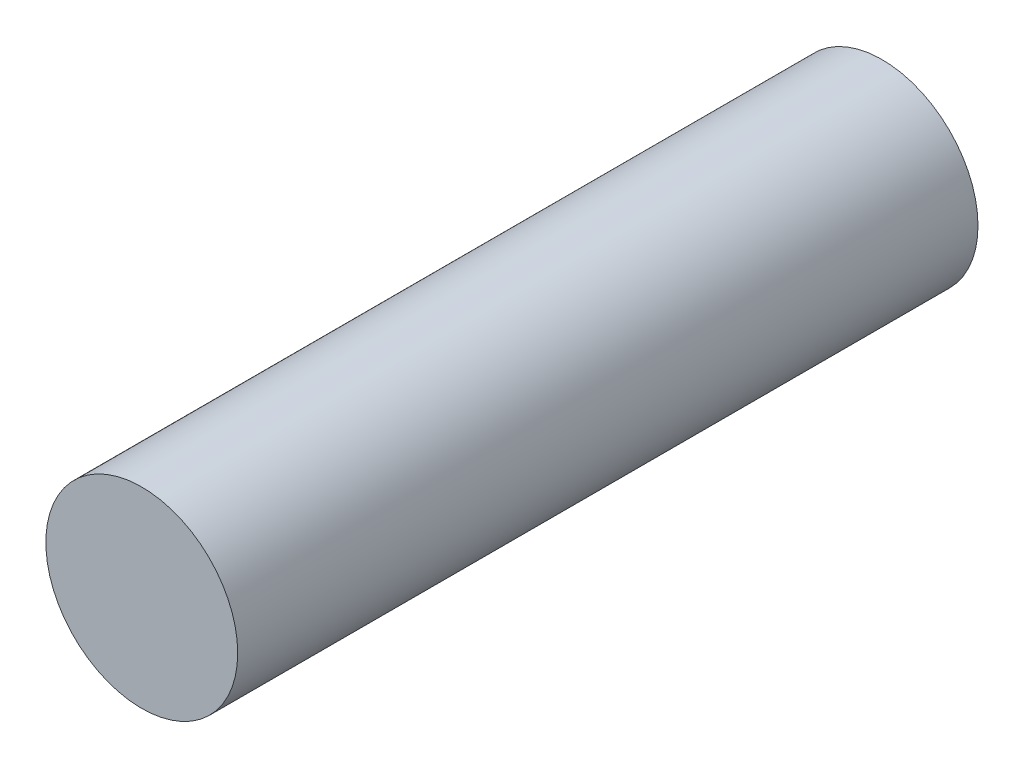
ISO-10303-21;
HEADER;
FILE_DESCRIPTION(('STEP AP214'),'2;1');
FILE_NAME('part.step','',(''),(''),'','','');
FILE_SCHEMA(('AUTOMOTIVE_DESIGN { 1 0 10303 214 1 1 1 1 }'));
ENDSEC;
DATA;
#1=APPLICATION_CONTEXT('core data for automotive mechanical design processes');
#2=APPLICATION_PROTOCOL_DEFINITION('international standard','automotive_design',2000,#1);
#3=PRODUCT_CONTEXT('',#1,'mechanical');
#4=PRODUCT('Part','Part','',(#3));
#5=PRODUCT_RELATED_PRODUCT_CATEGORY('part','',(#4));
#6=PRODUCT_DEFINITION_FORMATION('','',#4);
#7=PRODUCT_DEFINITION_CONTEXT('part definition',#1,'design');
#8=PRODUCT_DEFINITION('design','',#6,#7);
#9=PRODUCT_DEFINITION_SHAPE('','',#8);
#10=(LENGTH_UNIT() NAMED_UNIT(*) SI_UNIT(.MILLI.,.METRE.));
#11=(NAMED_UNIT(*) PLANE_ANGLE_UNIT() SI_UNIT($,.RADIAN.));
#12=(NAMED_UNIT(*) SI_UNIT($,.STERADIAN.) SOLID_ANGLE_UNIT());
#13=UNCERTAINTY_MEASURE_WITH_UNIT(LENGTH_MEASURE(1.E-05),#10,'distance_accuracy_value','');
#14=(GEOMETRIC_REPRESENTATION_CONTEXT(3) GLOBAL_UNCERTAINTY_ASSIGNED_CONTEXT((#13)) GLOBAL_UNIT_ASSIGNED_CONTEXT((#10,
#11,#12)) REPRESENTATION_CONTEXT('',''));
#15=CARTESIAN_POINT('',(0.,0.,0.));
#16=DIRECTION('',(0.,0.,1.));
#17=DIRECTION('',(1.,0.,0.));
#18=AXIS2_PLACEMENT_3D('',#15,#16,#17);
#19=CARTESIAN_POINT('',(0.,0.,24.5));
#20=DIRECTION('',(0.,0.,-1.));
#21=DIRECTION('',(-1.,0.,0.));
#22=AXIS2_PLACEMENT_3D('',#19,#20,#21);
#23=CYLINDRICAL_SURFACE('',#22,3.175);
#24=CARTESIAN_POINT('',(0.,0.,24.5));
#25=DIRECTION('',(0.,0.,1.));
#26=DIRECTION('',(1.,0.,0.));
#27=AXIS2_PLACEMENT_3D('',#24,#25,#26);
#28=CIRCLE('',#27,3.175);
#29=CARTESIAN_POINT('',(3.175,0.,24.5));
#30=VERTEX_POINT('',#29);
#31=EDGE_CURVE('E10',#30,#30,#28,.T.);
#32=ORIENTED_EDGE('',*,*,#31,.F.);
#33=EDGE_LOOP('',(#32));
#34=FACE_BOUND('',#33,.T.);
#35=CARTESIAN_POINT('',(0.,0.,0.));
#36=DIRECTION('',(0.,0.,1.));
#37=DIRECTION('',(1.,0.,0.));
#38=AXIS2_PLACEMENT_3D('',#35,#36,#37);
#39=CIRCLE('',#38,3.175);
#40=CARTESIAN_POINT('',(3.175,0.,0.));
#41=VERTEX_POINT('',#40);
#42=EDGE_CURVE('E34',#41,#41,#39,.T.);
#43=ORIENTED_EDGE('',*,*,#42,.T.);
#44=EDGE_LOOP('',(#43));
#45=FACE_BOUND('',#44,.T.);
#46=ADVANCED_FACE('F31',(#34,#45),#23,.T.);
#47=CARTESIAN_POINT('',(0.,0.,24.5));
#48=DIRECTION('',(0.,0.,1.));
#49=DIRECTION('',(1.,0.,0.));
#50=AXIS2_PLACEMENT_3D('',#47,#48,#49);
#51=PLANE('',#50);
#52=ORIENTED_EDGE('',*,*,#31,.T.);
#53=EDGE_LOOP('',(#52));
#54=FACE_BOUND('',#53,.T.);
#55=ADVANCED_FACE('F46',(#54),#51,.T.);
#56=CARTESIAN_POINT('',(0.,0.,0.));
#57=DIRECTION('',(0.,0.,1.));
#58=DIRECTION('',(1.,0.,0.));
#59=AXIS2_PLACEMENT_3D('',#56,#57,#58);
#60=PLANE('',#59);
#61=ORIENTED_EDGE('',*,*,#42,.F.);
#62=EDGE_LOOP('',(#61));
#63=FACE_BOUND('',#62,.T.);
#64=ADVANCED_FACE('F44',(#63),#60,.F.);
#65=CLOSED_SHELL('',(#46,#55,#64));
#66=MANIFOLD_SOLID_BREP('B2',#65);
#67=ADVANCED_BREP_SHAPE_REPRESENTATION('',(#18,#66),#14);
#68=SHAPE_DEFINITION_REPRESENTATION(#9,#67);
ENDSEC;
END-ISO-10303-21;
